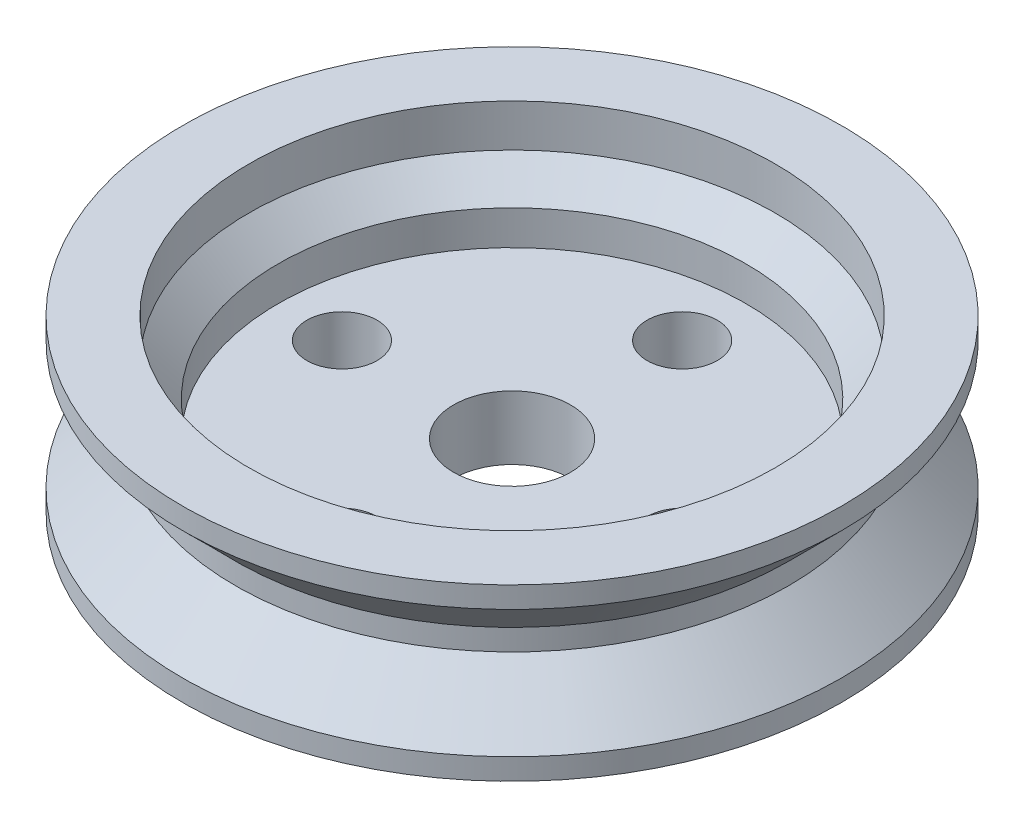
ISO-10303-21;
HEADER;
FILE_DESCRIPTION(('STEP AP214'),'2;1');
FILE_NAME('part.step','',(''),(''),'','','');
FILE_SCHEMA(('AUTOMOTIVE_DESIGN { 1 0 10303 214 1 1 1 1 }'));
ENDSEC;
DATA;
#1=APPLICATION_CONTEXT('core data for automotive mechanical design processes');
#2=APPLICATION_PROTOCOL_DEFINITION('international standard','automotive_design',2000,#1);
#3=PRODUCT_CONTEXT('',#1,'mechanical');
#4=PRODUCT('Part','Part','',(#3));
#5=PRODUCT_RELATED_PRODUCT_CATEGORY('part','',(#4));
#6=PRODUCT_DEFINITION_FORMATION('','',#4);
#7=PRODUCT_DEFINITION_CONTEXT('part definition',#1,'design');
#8=PRODUCT_DEFINITION('design','',#6,#7);
#9=PRODUCT_DEFINITION_SHAPE('','',#8);
#10=(LENGTH_UNIT() NAMED_UNIT(*) SI_UNIT(.MILLI.,.METRE.));
#11=(NAMED_UNIT(*) PLANE_ANGLE_UNIT() SI_UNIT($,.RADIAN.));
#12=(NAMED_UNIT(*) SI_UNIT($,.STERADIAN.) SOLID_ANGLE_UNIT());
#13=UNCERTAINTY_MEASURE_WITH_UNIT(LENGTH_MEASURE(1.E-05),#10,'distance_accuracy_value','');
#14=(GEOMETRIC_REPRESENTATION_CONTEXT(3) GLOBAL_UNCERTAINTY_ASSIGNED_CONTEXT((#13)) GLOBAL_UNIT_ASSIGNED_CONTEXT((#10,
#11,#12)) REPRESENTATION_CONTEXT('',''));
#15=CARTESIAN_POINT('',(0.,0.,0.));
#16=DIRECTION('',(0.,0.,1.));
#17=DIRECTION('',(1.,0.,0.));
#18=AXIS2_PLACEMENT_3D('',#15,#16,#17);
#19=CARTESIAN_POINT('',(0.,0.,0.));
#20=DIRECTION('',(0.,1.,0.));
#21=DIRECTION('',(-1.,0.,0.));
#22=AXIS2_PLACEMENT_3D('',#19,#20,#21);
#23=PLANE('',#22);
#24=CARTESIAN_POINT('',(0.,0.,8.));
#25=DIRECTION('',(0.,-1.,0.));
#26=DIRECTION('',(1.,0.,0.));
#27=AXIS2_PLACEMENT_3D('',#24,#25,#26);
#28=CIRCLE('',#27,1.65);
#29=CARTESIAN_POINT('',(1.65,0.,8.));
#30=VERTEX_POINT('',#29);
#31=EDGE_CURVE('E53',#30,#30,#28,.T.);
#32=ORIENTED_EDGE('',*,*,#31,.F.);
#33=EDGE_LOOP('',(#32));
#34=FACE_BOUND('',#33,.T.);
#35=CARTESIAN_POINT('',(0.,0.,0.));
#36=DIRECTION('',(0.,-1.,0.));
#37=DIRECTION('',(1.,0.,0.));
#38=AXIS2_PLACEMENT_3D('',#35,#36,#37);
#39=CIRCLE('',#38,2.75);
#40=CARTESIAN_POINT('',(2.75,0.,0.));
#41=VERTEX_POINT('',#40);
#42=EDGE_CURVE('E154',#41,#41,#39,.T.);
#43=ORIENTED_EDGE('',*,*,#42,.F.);
#44=EDGE_LOOP('',(#43));
#45=FACE_BOUND('',#44,.T.);
#46=CARTESIAN_POINT('',(8.00000000000023,0.,2.25904099284255E-13));
#47=DIRECTION('',(0.,-1.,0.));
#48=DIRECTION('',(1.,0.,0.));
#49=AXIS2_PLACEMENT_3D('',#46,#47,#48);
#50=CIRCLE('',#49,1.65000000000018);
#51=CARTESIAN_POINT('',(9.6500000000004,0.,2.25904099284255E-13));
#52=VERTEX_POINT('',#51);
#53=EDGE_CURVE('E158',#52,#52,#50,.T.);
#54=ORIENTED_EDGE('',*,*,#53,.F.);
#55=EDGE_LOOP('',(#54));
#56=FACE_BOUND('',#55,.T.);
#57=CARTESIAN_POINT('',(4.51808198568511E-13,0.,-8.));
#58=DIRECTION('',(0.,-1.,0.));
#59=DIRECTION('',(1.,0.,0.));
#60=AXIS2_PLACEMENT_3D('',#57,#58,#59);
#61=CIRCLE('',#60,1.65000000000049);
#62=CARTESIAN_POINT('',(1.65000000000094,0.,-8.));
#63=VERTEX_POINT('',#62);
#64=EDGE_CURVE('E75',#63,#63,#61,.T.);
#65=ORIENTED_EDGE('',*,*,#64,.F.);
#66=EDGE_LOOP('',(#65));
#67=FACE_BOUND('',#66,.T.);
#68=CARTESIAN_POINT('',(-7.99999999999977,0.,-2.26883816723573E-13));
#69=DIRECTION('',(0.,-1.,0.));
#70=DIRECTION('',(1.,0.,0.));
#71=AXIS2_PLACEMENT_3D('',#68,#69,#70);
#72=CIRCLE('',#71,1.65000000000036);
#73=CARTESIAN_POINT('',(-6.34999999999941,0.,-2.26883816723573E-13));
#74=VERTEX_POINT('',#73);
#75=EDGE_CURVE('E164',#74,#74,#72,.T.);
#76=ORIENTED_EDGE('',*,*,#75,.F.);
#77=EDGE_LOOP('',(#76));
#78=FACE_BOUND('',#77,.T.);
#79=CARTESIAN_POINT('',(0.,0.,0.));
#80=DIRECTION('',(0.,-1.,0.));
#81=DIRECTION('',(1.,0.,0.));
#82=AXIS2_PLACEMENT_3D('',#79,#80,#81);
#83=CIRCLE('',#82,15.5);
#84=CARTESIAN_POINT('',(15.5,0.,0.));
#85=VERTEX_POINT('',#84);
#86=EDGE_CURVE('E10',#85,#85,#83,.T.);
#87=ORIENTED_EDGE('',*,*,#86,.T.);
#88=EDGE_LOOP('',(#87));
#89=FACE_BOUND('',#88,.T.);
#90=ADVANCED_FACE('F33',(#34,#45,#56,#67,#78,#89),#23,.F.);
#91=CARTESIAN_POINT('',(0.,0.,0.));
#92=DIRECTION('',(0.,-1.,0.));
#93=DIRECTION('',(1.,0.,0.));
#94=AXIS2_PLACEMENT_3D('',#91,#92,#93);
#95=CYLINDRICAL_SURFACE('',#94,15.5);
#96=ORIENTED_EDGE('',*,*,#86,.F.);
#97=EDGE_LOOP('',(#96));
#98=FACE_BOUND('',#97,.T.);
#99=CARTESIAN_POINT('',(0.,1.,0.));
#100=DIRECTION('',(0.,-1.,0.));
#101=DIRECTION('',(1.,0.,0.));
#102=AXIS2_PLACEMENT_3D('',#99,#100,#101);
#103=CIRCLE('',#102,15.5);
#104=CARTESIAN_POINT('',(15.5,1.,0.));
#105=VERTEX_POINT('',#104);
#106=EDGE_CURVE('E40',#105,#105,#103,.T.);
#107=ORIENTED_EDGE('',*,*,#106,.T.);
#108=EDGE_LOOP('',(#107));
#109=FACE_BOUND('',#108,.T.);
#110=ADVANCED_FACE('F142',(#98,#109),#95,.T.);
#111=CARTESIAN_POINT('',(0.,3.49999999999998,0.));
#112=DIRECTION('',(0.,-1.,0.));
#113=DIRECTION('',(1.,0.,0.));
#114=AXIS2_PLACEMENT_3D('',#111,#112,#113);
#115=CONICAL_SURFACE('',#114,13.,0.785398163397453);
#116=ORIENTED_EDGE('',*,*,#106,.F.);
#117=EDGE_LOOP('',(#116));
#118=FACE_BOUND('',#117,.T.);
#119=CARTESIAN_POINT('',(0.,3.49999999999998,0.));
#120=DIRECTION('',(0.,-1.,0.));
#121=DIRECTION('',(1.,0.,0.));
#122=AXIS2_PLACEMENT_3D('',#119,#120,#121);
#123=CIRCLE('',#122,13.);
#124=CARTESIAN_POINT('',(13.,3.49999999999998,0.));
#125=VERTEX_POINT('',#124);
#126=EDGE_CURVE('E45',#125,#125,#123,.T.);
#127=ORIENTED_EDGE('',*,*,#126,.T.);
#128=EDGE_LOOP('',(#127));
#129=FACE_BOUND('',#128,.T.);
#130=ADVANCED_FACE('F94',(#118,#129),#115,.T.);
#131=CARTESIAN_POINT('',(0.,0.,0.));
#132=DIRECTION('',(0.,-1.,0.));
#133=DIRECTION('',(1.,0.,0.));
#134=AXIS2_PLACEMENT_3D('',#131,#132,#133);
#135=CYLINDRICAL_SURFACE('',#134,13.);
#136=ORIENTED_EDGE('',*,*,#126,.F.);
#137=EDGE_LOOP('',(#136));
#138=FACE_BOUND('',#137,.T.);
#139=CARTESIAN_POINT('',(0.,4.49999999999997,0.));
#140=DIRECTION('',(0.,-1.,0.));
#141=DIRECTION('',(1.,0.,0.));
#142=AXIS2_PLACEMENT_3D('',#139,#140,#141);
#143=CIRCLE('',#142,13.);
#144=CARTESIAN_POINT('',(13.,4.49999999999998,0.));
#145=VERTEX_POINT('',#144);
#146=EDGE_CURVE('E89',#145,#145,#143,.T.);
#147=ORIENTED_EDGE('',*,*,#146,.T.);
#148=EDGE_LOOP('',(#147));
#149=FACE_BOUND('',#148,.T.);
#150=ADVANCED_FACE('F96',(#138,#149),#135,.T.);
#151=CARTESIAN_POINT('',(0.,6.99999999999995,0.));
#152=DIRECTION('',(0.,1.,0.));
#153=DIRECTION('',(-1.,0.,0.));
#154=AXIS2_PLACEMENT_3D('',#151,#152,#153);
#155=CONICAL_SURFACE('',#154,15.5,0.785398163397453);
#156=ORIENTED_EDGE('',*,*,#146,.F.);
#157=EDGE_LOOP('',(#156));
#158=FACE_BOUND('',#157,.T.);
#159=CARTESIAN_POINT('',(0.,6.99999999999995,0.));
#160=DIRECTION('',(0.,-1.,0.));
#161=DIRECTION('',(1.,0.,0.));
#162=AXIS2_PLACEMENT_3D('',#159,#160,#161);
#163=CIRCLE('',#162,15.5);
#164=CARTESIAN_POINT('',(15.5,6.99999999999995,0.));
#165=VERTEX_POINT('',#164);
#166=EDGE_CURVE('E86',#165,#165,#163,.T.);
#167=ORIENTED_EDGE('',*,*,#166,.T.);
#168=EDGE_LOOP('',(#167));
#169=FACE_BOUND('',#168,.T.);
#170=ADVANCED_FACE('F99',(#158,#169),#155,.T.);
#171=CARTESIAN_POINT('',(0.,0.,0.));
#172=DIRECTION('',(0.,-1.,0.));
#173=DIRECTION('',(1.,0.,0.));
#174=AXIS2_PLACEMENT_3D('',#171,#172,#173);
#175=CYLINDRICAL_SURFACE('',#174,15.5);
#176=ORIENTED_EDGE('',*,*,#166,.F.);
#177=EDGE_LOOP('',(#176));
#178=FACE_BOUND('',#177,.T.);
#179=CARTESIAN_POINT('',(0.,7.99999999999995,0.));
#180=DIRECTION('',(0.,-1.,0.));
#181=DIRECTION('',(1.,0.,0.));
#182=AXIS2_PLACEMENT_3D('',#179,#180,#181);
#183=CIRCLE('',#182,15.5);
#184=CARTESIAN_POINT('',(15.5,7.99999999999995,0.));
#185=VERTEX_POINT('',#184);
#186=EDGE_CURVE('E83',#185,#185,#183,.T.);
#187=ORIENTED_EDGE('',*,*,#186,.T.);
#188=EDGE_LOOP('',(#187));
#189=FACE_BOUND('',#188,.T.);
#190=ADVANCED_FACE('F105',(#178,#189),#175,.T.);
#191=CARTESIAN_POINT('',(-15.5,7.99999999999994,0.));
#192=DIRECTION('',(0.,-1.,0.));
#193=DIRECTION('',(1.,0.,0.));
#194=AXIS2_PLACEMENT_3D('',#191,#192,#193);
#195=PLANE('',#194);
#196=ORIENTED_EDGE('',*,*,#186,.F.);
#197=EDGE_LOOP('',(#196));
#198=FACE_BOUND('',#197,.T.);
#199=CARTESIAN_POINT('',(0.,7.99999999999995,0.));
#200=DIRECTION('',(0.,-1.,0.));
#201=DIRECTION('',(1.,0.,0.));
#202=AXIS2_PLACEMENT_3D('',#199,#200,#201);
#203=CIRCLE('',#202,12.3786796564403);
#204=CARTESIAN_POINT('',(12.3786796564403,7.99999999999995,0.));
#205=VERTEX_POINT('',#204);
#206=EDGE_CURVE('E80',#205,#205,#203,.T.);
#207=ORIENTED_EDGE('',*,*,#206,.T.);
#208=EDGE_LOOP('',(#207));
#209=FACE_BOUND('',#208,.T.);
#210=ADVANCED_FACE('F111',(#198,#209),#195,.F.);
#211=CARTESIAN_POINT('',(0.,0.,0.));
#212=DIRECTION('',(0.,-1.,0.));
#213=DIRECTION('',(1.,0.,0.));
#214=AXIS2_PLACEMENT_3D('',#211,#212,#213);
#215=CYLINDRICAL_SURFACE('',#214,12.3786796564403);
#216=ORIENTED_EDGE('',*,*,#206,.F.);
#217=EDGE_LOOP('',(#216));
#218=FACE_BOUND('',#217,.T.);
#219=CARTESIAN_POINT('',(0.,5.99999999999995,0.));
#220=DIRECTION('',(0.,-1.,0.));
#221=DIRECTION('',(1.,0.,0.));
#222=AXIS2_PLACEMENT_3D('',#219,#220,#221);
#223=CIRCLE('',#222,12.3786796564403);
#224=CARTESIAN_POINT('',(12.3786796564403,5.99999999999995,0.));
#225=VERTEX_POINT('',#224);
#226=EDGE_CURVE('E72',#225,#225,#223,.T.);
#227=ORIENTED_EDGE('',*,*,#226,.T.);
#228=EDGE_LOOP('',(#227));
#229=FACE_BOUND('',#228,.T.);
#230=ADVANCED_FACE('F117',(#218,#229),#215,.F.);
#231=CARTESIAN_POINT('',(0.,4.62132034355963,0.));
#232=DIRECTION('',(0.,1.,0.));
#233=DIRECTION('',(-1.,0.,0.));
#234=AXIS2_PLACEMENT_3D('',#231,#232,#233);
#235=CONICAL_SURFACE('',#234,11.,0.785398163397454);
#236=ORIENTED_EDGE('',*,*,#226,.F.);
#237=EDGE_LOOP('',(#236));
#238=FACE_BOUND('',#237,.T.);
#239=CARTESIAN_POINT('',(0.,4.62132034355963,0.));
#240=DIRECTION('',(0.,-1.,0.));
#241=DIRECTION('',(1.,0.,0.));
#242=AXIS2_PLACEMENT_3D('',#239,#240,#241);
#243=CIRCLE('',#242,11.);
#244=CARTESIAN_POINT('',(11.,4.62132034355963,0.));
#245=VERTEX_POINT('',#244);
#246=EDGE_CURVE('E67',#245,#245,#243,.T.);
#247=ORIENTED_EDGE('',*,*,#246,.T.);
#248=EDGE_LOOP('',(#247));
#249=FACE_BOUND('',#248,.T.);
#250=ADVANCED_FACE('F123',(#238,#249),#235,.F.);
#251=CARTESIAN_POINT('',(0.,0.,0.));
#252=DIRECTION('',(0.,-1.,0.));
#253=DIRECTION('',(1.,0.,0.));
#254=AXIS2_PLACEMENT_3D('',#251,#252,#253);
#255=CYLINDRICAL_SURFACE('',#254,11.);
#256=ORIENTED_EDGE('',*,*,#246,.F.);
#257=EDGE_LOOP('',(#256));
#258=FACE_BOUND('',#257,.T.);
#259=CARTESIAN_POINT('',(0.,3.,0.));
#260=DIRECTION('',(0.,-1.,0.));
#261=DIRECTION('',(1.,0.,0.));
#262=AXIS2_PLACEMENT_3D('',#259,#260,#261);
#263=CIRCLE('',#262,11.);
#264=CARTESIAN_POINT('',(11.,3.,0.));
#265=VERTEX_POINT('',#264);
#266=EDGE_CURVE('E63',#265,#265,#263,.T.);
#267=ORIENTED_EDGE('',*,*,#266,.T.);
#268=EDGE_LOOP('',(#267));
#269=FACE_BOUND('',#268,.T.);
#270=ADVANCED_FACE('F129',(#258,#269),#255,.F.);
#271=CARTESIAN_POINT('',(-11.,3.,0.));
#272=DIRECTION('',(0.,-1.,0.));
#273=DIRECTION('',(1.,0.,0.));
#274=AXIS2_PLACEMENT_3D('',#271,#272,#273);
#275=PLANE('',#274);
#276=CARTESIAN_POINT('',(0.,3.,8.));
#277=DIRECTION('',(0.,-1.,0.));
#278=DIRECTION('',(1.,0.,0.));
#279=AXIS2_PLACEMENT_3D('',#276,#277,#278);
#280=CIRCLE('',#279,1.65);
#281=CARTESIAN_POINT('',(1.65,3.,8.));
#282=VERTEX_POINT('',#281);
#283=EDGE_CURVE('E36',#282,#282,#280,.T.);
#284=ORIENTED_EDGE('',*,*,#283,.T.);
#285=EDGE_LOOP('',(#284));
#286=FACE_BOUND('',#285,.T.);
#287=CARTESIAN_POINT('',(0.,3.,0.));
#288=DIRECTION('',(0.,-1.,0.));
#289=DIRECTION('',(1.,0.,0.));
#290=AXIS2_PLACEMENT_3D('',#287,#288,#289);
#291=CIRCLE('',#290,2.75);
#292=CARTESIAN_POINT('',(2.75,3.,0.));
#293=VERTEX_POINT('',#292);
#294=EDGE_CURVE('E58',#293,#293,#291,.T.);
#295=ORIENTED_EDGE('',*,*,#294,.T.);
#296=EDGE_LOOP('',(#295));
#297=FACE_BOUND('',#296,.T.);
#298=CARTESIAN_POINT('',(8.00000000000022,3.,2.25904099284255E-13));
#299=DIRECTION('',(0.,-1.,0.));
#300=DIRECTION('',(1.,0.,0.));
#301=AXIS2_PLACEMENT_3D('',#298,#299,#300);
#302=CIRCLE('',#301,1.65000000000018);
#303=CARTESIAN_POINT('',(9.6500000000004,3.,2.25904099284255E-13));
#304=VERTEX_POINT('',#303);
#305=EDGE_CURVE('E56',#304,#304,#302,.T.);
#306=ORIENTED_EDGE('',*,*,#305,.T.);
#307=EDGE_LOOP('',(#306));
#308=FACE_BOUND('',#307,.T.);
#309=CARTESIAN_POINT('',(4.51440804528766E-13,3.,-8.));
#310=DIRECTION('',(0.,-1.,0.));
#311=DIRECTION('',(1.,0.,0.));
#312=AXIS2_PLACEMENT_3D('',#309,#310,#311);
#313=CIRCLE('',#312,1.65000000000049);
#314=CARTESIAN_POINT('',(1.65000000000094,3.,-8.));
#315=VERTEX_POINT('',#314);
#316=EDGE_CURVE('E52',#315,#315,#313,.T.);
#317=ORIENTED_EDGE('',*,*,#316,.T.);
#318=EDGE_LOOP('',(#317));
#319=FACE_BOUND('',#318,.T.);
#320=CARTESIAN_POINT('',(-7.99999999999978,3.,-2.26883816723573E-13));
#321=DIRECTION('',(0.,-1.,0.));
#322=DIRECTION('',(1.,0.,0.));
#323=AXIS2_PLACEMENT_3D('',#320,#321,#322);
#324=CIRCLE('',#323,1.65000000000036);
#325=CARTESIAN_POINT('',(-6.34999999999941,3.,-2.26883816723573E-13));
#326=VERTEX_POINT('',#325);
#327=EDGE_CURVE('E49',#326,#326,#324,.T.);
#328=ORIENTED_EDGE('',*,*,#327,.T.);
#329=EDGE_LOOP('',(#328));
#330=FACE_BOUND('',#329,.T.);
#331=ORIENTED_EDGE('',*,*,#266,.F.);
#332=EDGE_LOOP('',(#331));
#333=FACE_BOUND('',#332,.T.);
#334=ADVANCED_FACE('F134',(#286,#297,#308,#319,#330,#333),#275,.F.);
#335=CARTESIAN_POINT('',(-7.99999999999978,7.99999999999995,-2.26883816723573E-13));
#336=DIRECTION('',(0.,-1.,0.));
#337=DIRECTION('',(1.,0.,0.));
#338=AXIS2_PLACEMENT_3D('',#335,#336,#337);
#339=CYLINDRICAL_SURFACE('',#338,1.65000000000036);
#340=ORIENTED_EDGE('',*,*,#75,.T.);
#341=EDGE_LOOP('',(#340));
#342=FACE_BOUND('',#341,.T.);
#343=ORIENTED_EDGE('',*,*,#327,.F.);
#344=EDGE_LOOP('',(#343));
#345=FACE_BOUND('',#344,.T.);
#346=ADVANCED_FACE('F139',(#342,#345),#339,.F.);
#347=CARTESIAN_POINT('',(4.50828481129193E-13,7.99999999999995,-8.));
#348=DIRECTION('',(0.,-1.,0.));
#349=DIRECTION('',(1.,0.,0.));
#350=AXIS2_PLACEMENT_3D('',#347,#348,#349);
#351=CYLINDRICAL_SURFACE('',#350,1.65000000000049);
#352=ORIENTED_EDGE('',*,*,#64,.T.);
#353=EDGE_LOOP('',(#352));
#354=FACE_BOUND('',#353,.T.);
#355=ORIENTED_EDGE('',*,*,#316,.F.);
#356=EDGE_LOOP('',(#355));
#357=FACE_BOUND('',#356,.T.);
#358=ADVANCED_FACE('F174',(#354,#357),#351,.F.);
#359=CARTESIAN_POINT('',(8.00000000000022,7.99999999999995,2.25904099284255E-13));
#360=DIRECTION('',(0.,-1.,0.));
#361=DIRECTION('',(1.,0.,0.));
#362=AXIS2_PLACEMENT_3D('',#359,#360,#361);
#363=CYLINDRICAL_SURFACE('',#362,1.65000000000018);
#364=ORIENTED_EDGE('',*,*,#53,.T.);
#365=EDGE_LOOP('',(#364));
#366=FACE_BOUND('',#365,.T.);
#367=ORIENTED_EDGE('',*,*,#305,.F.);
#368=EDGE_LOOP('',(#367));
#369=FACE_BOUND('',#368,.T.);
#370=ADVANCED_FACE('F170',(#366,#369),#363,.F.);
#371=CARTESIAN_POINT('',(0.,7.99999999999995,0.));
#372=DIRECTION('',(0.,-1.,0.));
#373=DIRECTION('',(1.,0.,0.));
#374=AXIS2_PLACEMENT_3D('',#371,#372,#373);
#375=CYLINDRICAL_SURFACE('',#374,2.75);
#376=ORIENTED_EDGE('',*,*,#42,.T.);
#377=EDGE_LOOP('',(#376));
#378=FACE_BOUND('',#377,.T.);
#379=ORIENTED_EDGE('',*,*,#294,.F.);
#380=EDGE_LOOP('',(#379));
#381=FACE_BOUND('',#380,.T.);
#382=ADVANCED_FACE('F173',(#378,#381),#375,.F.);
#383=CARTESIAN_POINT('',(0.,7.99999999999995,8.));
#384=DIRECTION('',(0.,-1.,0.));
#385=DIRECTION('',(1.,0.,0.));
#386=AXIS2_PLACEMENT_3D('',#383,#384,#385);
#387=CYLINDRICAL_SURFACE('',#386,1.65);
#388=ORIENTED_EDGE('',*,*,#31,.T.);
#389=EDGE_LOOP('',(#388));
#390=FACE_BOUND('',#389,.T.);
#391=ORIENTED_EDGE('',*,*,#283,.F.);
#392=EDGE_LOOP('',(#391));
#393=FACE_BOUND('',#392,.T.);
#394=ADVANCED_FACE('F193',(#390,#393),#387,.F.);
#395=CLOSED_SHELL('',(#90,#110,#130,#150,#170,#190,#210,#230,#250,#270,#334,#346,#358,#370,#382,#394));
#396=MANIFOLD_SOLID_BREP('B2',#395);
#397=ADVANCED_BREP_SHAPE_REPRESENTATION('',(#18,#396),#14);
#398=SHAPE_DEFINITION_REPRESENTATION(#9,#397);
ENDSEC;
END-ISO-10303-21;
